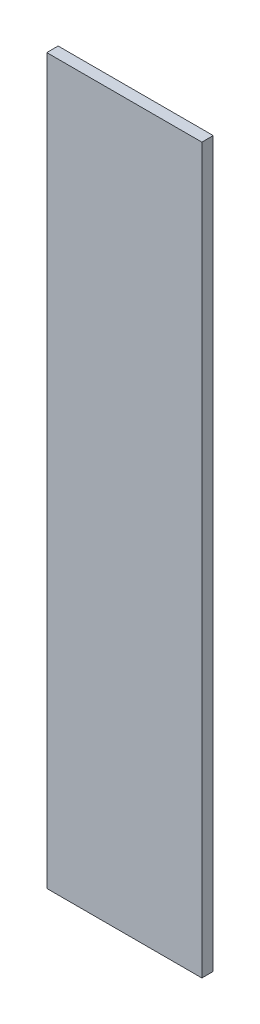
ISO-10303-21;
HEADER;
FILE_DESCRIPTION(('STEP AP214'),'2;1');
FILE_NAME('part.step','',(''),(''),'','','');
FILE_SCHEMA(('AUTOMOTIVE_DESIGN { 1 0 10303 214 1 1 1 1 }'));
ENDSEC;
DATA;
#1=APPLICATION_CONTEXT('core data for automotive mechanical design processes');
#2=APPLICATION_PROTOCOL_DEFINITION('international standard','automotive_design',2000,#1);
#3=PRODUCT_CONTEXT('',#1,'mechanical');
#4=PRODUCT('Part','Part','',(#3));
#5=PRODUCT_RELATED_PRODUCT_CATEGORY('part','',(#4));
#6=PRODUCT_DEFINITION_FORMATION('','',#4);
#7=PRODUCT_DEFINITION_CONTEXT('part definition',#1,'design');
#8=PRODUCT_DEFINITION('design','',#6,#7);
#9=PRODUCT_DEFINITION_SHAPE('','',#8);
#10=(LENGTH_UNIT() NAMED_UNIT(*) SI_UNIT(.MILLI.,.METRE.));
#11=(NAMED_UNIT(*) PLANE_ANGLE_UNIT() SI_UNIT($,.RADIAN.));
#12=(NAMED_UNIT(*) SI_UNIT($,.STERADIAN.) SOLID_ANGLE_UNIT());
#13=UNCERTAINTY_MEASURE_WITH_UNIT(LENGTH_MEASURE(1.E-05),#10,'distance_accuracy_value','');
#14=(GEOMETRIC_REPRESENTATION_CONTEXT(3) GLOBAL_UNCERTAINTY_ASSIGNED_CONTEXT((#13)) GLOBAL_UNIT_ASSIGNED_CONTEXT((#10,
#11,#12)) REPRESENTATION_CONTEXT('',''));
#15=CARTESIAN_POINT('',(0.,0.,0.));
#16=DIRECTION('',(0.,0.,1.));
#17=DIRECTION('',(1.,0.,0.));
#18=AXIS2_PLACEMENT_3D('',#15,#16,#17);
#19=CARTESIAN_POINT('',(-66.3294982082664,77.6273885350318,5.5));
#20=DIRECTION('',(1.,0.,0.));
#21=DIRECTION('',(0.,1.,0.));
#22=AXIS2_PLACEMENT_3D('',#19,#20,#21);
#23=PLANE('',#22);
#24=DIRECTION('',(0.,-1.,0.));
#25=VECTOR('',#24,1.);
#26=CARTESIAN_POINT('',(-66.3294982082664,77.6273885350318,0.));
#27=LINE('',#26,#25);
#28=CARTESIAN_POINT('',(-66.3294982082664,77.6273885350318,0.));
#29=VERTEX_POINT('',#28);
#30=CARTESIAN_POINT('',(-66.3294982082664,-272.372611464968,0.));
#31=VERTEX_POINT('',#30);
#32=EDGE_CURVE('E97',#29,#31,#27,.T.);
#33=ORIENTED_EDGE('',*,*,#32,.T.);
#34=DIRECTION('',(0.,0.,-1.));
#35=VECTOR('',#34,1.);
#36=CARTESIAN_POINT('',(-66.3294982082664,-272.372611464968,5.5));
#37=LINE('',#36,#35);
#38=CARTESIAN_POINT('',(-66.3294982082664,-272.372611464968,5.5));
#39=VERTEX_POINT('',#38);
#40=EDGE_CURVE('E11',#39,#31,#37,.T.);
#41=ORIENTED_EDGE('',*,*,#40,.F.);
#42=DIRECTION('',(0.,-1.,0.));
#43=VECTOR('',#42,1.);
#44=CARTESIAN_POINT('',(-66.3294982082664,77.6273885350318,5.5));
#45=LINE('',#44,#43);
#46=CARTESIAN_POINT('',(-66.3294982082664,77.6273885350318,5.5));
#47=VERTEX_POINT('',#46);
#48=EDGE_CURVE('E85',#47,#39,#45,.T.);
#49=ORIENTED_EDGE('',*,*,#48,.F.);
#50=DIRECTION('',(0.,0.,-1.));
#51=VECTOR('',#50,1.);
#52=CARTESIAN_POINT('',(-66.3294982082664,77.6273885350318,5.5));
#53=LINE('',#52,#51);
#54=EDGE_CURVE('E93',#47,#29,#53,.T.);
#55=ORIENTED_EDGE('',*,*,#54,.T.);
#56=EDGE_LOOP('',(#33,#41,#49,#55));
#57=FACE_BOUND('',#56,.T.);
#58=ADVANCED_FACE('F34',(#57),#23,.F.);
#59=CARTESIAN_POINT('',(-66.3294982082664,-272.372611464968,5.5));
#60=DIRECTION('',(0.,1.,0.));
#61=DIRECTION('',(0.,0.,1.));
#62=AXIS2_PLACEMENT_3D('',#59,#60,#61);
#63=PLANE('',#62);
#64=DIRECTION('',(1.,0.,0.));
#65=VECTOR('',#64,1.);
#66=CARTESIAN_POINT('',(-66.3294982082664,-272.372611464968,0.));
#67=LINE('',#66,#65);
#68=CARTESIAN_POINT('',(8.67050179173359,-272.372611464968,0.));
#69=VERTEX_POINT('',#68);
#70=EDGE_CURVE('E89',#31,#69,#67,.T.);
#71=ORIENTED_EDGE('',*,*,#70,.T.);
#72=DIRECTION('',(0.,0.,-1.));
#73=VECTOR('',#72,1.);
#74=CARTESIAN_POINT('',(8.67050179173359,-272.372611464968,5.5));
#75=LINE('',#74,#73);
#76=CARTESIAN_POINT('',(8.67050179173359,-272.372611464968,5.5));
#77=VERTEX_POINT('',#76);
#78=EDGE_CURVE('E42',#77,#69,#75,.T.);
#79=ORIENTED_EDGE('',*,*,#78,.F.);
#80=DIRECTION('',(1.,0.,0.));
#81=VECTOR('',#80,1.);
#82=CARTESIAN_POINT('',(-66.3294982082664,-272.372611464968,5.5));
#83=LINE('',#82,#81);
#84=EDGE_CURVE('E80',#39,#77,#83,.T.);
#85=ORIENTED_EDGE('',*,*,#84,.F.);
#86=ORIENTED_EDGE('',*,*,#40,.T.);
#87=EDGE_LOOP('',(#71,#79,#85,#86));
#88=FACE_BOUND('',#87,.T.);
#89=ADVANCED_FACE('F88',(#88),#63,.F.);
#90=CARTESIAN_POINT('',(8.67050179173356,77.6273885350318,5.5));
#91=DIRECTION('',(-1.,0.,0.));
#92=DIRECTION('',(0.,-1.,0.));
#93=AXIS2_PLACEMENT_3D('',#90,#91,#92);
#94=PLANE('',#93);
#95=DIRECTION('',(0.,1.,0.));
#96=VECTOR('',#95,1.);
#97=CARTESIAN_POINT('',(8.67050179173356,77.6273885350318,0.));
#98=LINE('',#97,#96);
#99=CARTESIAN_POINT('',(8.67050179173356,77.6273885350318,0.));
#100=VERTEX_POINT('',#99);
#101=EDGE_CURVE('E67',#69,#100,#98,.T.);
#102=ORIENTED_EDGE('',*,*,#101,.T.);
#103=DIRECTION('',(0.,0.,-1.));
#104=VECTOR('',#103,1.);
#105=CARTESIAN_POINT('',(8.67050179173356,77.6273885350318,5.5));
#106=LINE('',#105,#104);
#107=CARTESIAN_POINT('',(8.67050179173356,77.6273885350318,5.5));
#108=VERTEX_POINT('',#107);
#109=EDGE_CURVE('E90',#108,#100,#106,.T.);
#110=ORIENTED_EDGE('',*,*,#109,.F.);
#111=DIRECTION('',(0.,1.,0.));
#112=VECTOR('',#111,1.);
#113=CARTESIAN_POINT('',(8.67050179173356,77.6273885350318,5.5));
#114=LINE('',#113,#112);
#115=EDGE_CURVE('E83',#77,#108,#114,.T.);
#116=ORIENTED_EDGE('',*,*,#115,.F.);
#117=ORIENTED_EDGE('',*,*,#78,.T.);
#118=EDGE_LOOP('',(#102,#110,#116,#117));
#119=FACE_BOUND('',#118,.T.);
#120=ADVANCED_FACE('F91',(#119),#94,.F.);
#121=CARTESIAN_POINT('',(-66.3294982082664,77.6273885350318,5.5));
#122=DIRECTION('',(0.,-1.,0.));
#123=DIRECTION('',(0.,0.,-1.));
#124=AXIS2_PLACEMENT_3D('',#121,#122,#123);
#125=PLANE('',#124);
#126=DIRECTION('',(-1.,0.,0.));
#127=VECTOR('',#126,1.);
#128=CARTESIAN_POINT('',(-66.3294982082664,77.6273885350318,0.));
#129=LINE('',#128,#127);
#130=EDGE_CURVE('E73',#100,#29,#129,.T.);
#131=ORIENTED_EDGE('',*,*,#130,.T.);
#132=ORIENTED_EDGE('',*,*,#54,.F.);
#133=DIRECTION('',(-1.,0.,0.));
#134=VECTOR('',#133,1.);
#135=CARTESIAN_POINT('',(-66.3294982082664,77.6273885350318,5.5));
#136=LINE('',#135,#134);
#137=EDGE_CURVE('E50',#108,#47,#136,.T.);
#138=ORIENTED_EDGE('',*,*,#137,.F.);
#139=ORIENTED_EDGE('',*,*,#109,.T.);
#140=EDGE_LOOP('',(#131,#132,#138,#139));
#141=FACE_BOUND('',#140,.T.);
#142=ADVANCED_FACE('F104',(#141),#125,.F.);
#143=CARTESIAN_POINT('',(0.,0.,5.5));
#144=DIRECTION('',(0.,0.,1.));
#145=DIRECTION('',(1.,0.,0.));
#146=AXIS2_PLACEMENT_3D('',#143,#144,#145);
#147=PLANE('',#146);
#148=ORIENTED_EDGE('',*,*,#48,.T.);
#149=ORIENTED_EDGE('',*,*,#84,.T.);
#150=ORIENTED_EDGE('',*,*,#115,.T.);
#151=ORIENTED_EDGE('',*,*,#137,.T.);
#152=EDGE_LOOP('',(#148,#149,#150,#151));
#153=FACE_BOUND('',#152,.T.);
#154=ADVANCED_FACE('F81',(#153),#147,.T.);
#155=CARTESIAN_POINT('',(0.,0.,0.));
#156=DIRECTION('',(0.,0.,1.));
#157=DIRECTION('',(1.,0.,0.));
#158=AXIS2_PLACEMENT_3D('',#155,#156,#157);
#159=PLANE('',#158);
#160=ORIENTED_EDGE('',*,*,#32,.F.);
#161=ORIENTED_EDGE('',*,*,#130,.F.);
#162=ORIENTED_EDGE('',*,*,#101,.F.);
#163=ORIENTED_EDGE('',*,*,#70,.F.);
#164=EDGE_LOOP('',(#160,#161,#162,#163));
#165=FACE_BOUND('',#164,.T.);
#166=ADVANCED_FACE('F107',(#165),#159,.F.);
#167=CLOSED_SHELL('',(#58,#89,#120,#142,#154,#166));
#168=MANIFOLD_SOLID_BREP('B2',#167);
#169=ADVANCED_BREP_SHAPE_REPRESENTATION('',(#18,#168),#14);
#170=SHAPE_DEFINITION_REPRESENTATION(#9,#169);
ENDSEC;
END-ISO-10303-21;
